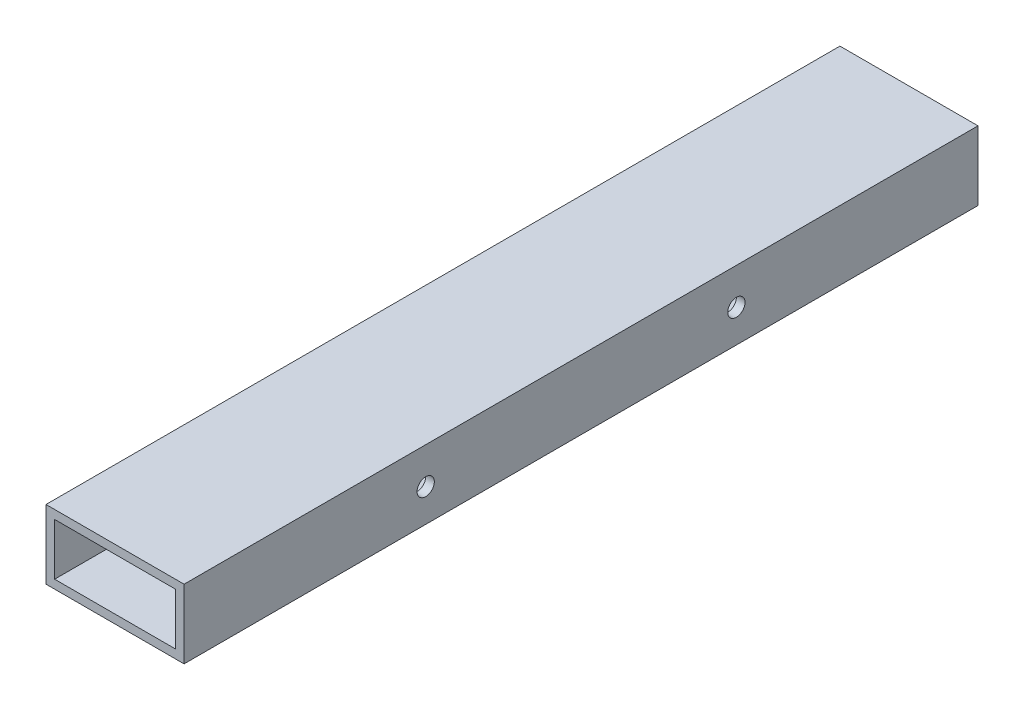
ISO-10303-21;
HEADER;
FILE_DESCRIPTION(('STEP AP214'),'2;1');
FILE_NAME('part.step','',(''),(''),'','','');
FILE_SCHEMA(('AUTOMOTIVE_DESIGN { 1 0 10303 214 1 1 1 1 }'));
ENDSEC;
DATA;
#1=APPLICATION_CONTEXT('core data for automotive mechanical design processes');
#2=APPLICATION_PROTOCOL_DEFINITION('international standard','automotive_design',2000,#1);
#3=PRODUCT_CONTEXT('',#1,'mechanical');
#4=PRODUCT('Part','Part','',(#3));
#5=PRODUCT_RELATED_PRODUCT_CATEGORY('part','',(#4));
#6=PRODUCT_DEFINITION_FORMATION('','',#4);
#7=PRODUCT_DEFINITION_CONTEXT('part definition',#1,'design');
#8=PRODUCT_DEFINITION('design','',#6,#7);
#9=PRODUCT_DEFINITION_SHAPE('','',#8);
#10=(LENGTH_UNIT() NAMED_UNIT(*) SI_UNIT(.MILLI.,.METRE.));
#11=(NAMED_UNIT(*) PLANE_ANGLE_UNIT() SI_UNIT($,.RADIAN.));
#12=(NAMED_UNIT(*) SI_UNIT($,.STERADIAN.) SOLID_ANGLE_UNIT());
#13=UNCERTAINTY_MEASURE_WITH_UNIT(LENGTH_MEASURE(1.E-05),#10,'distance_accuracy_value','');
#14=(GEOMETRIC_REPRESENTATION_CONTEXT(3) GLOBAL_UNCERTAINTY_ASSIGNED_CONTEXT((#13)) GLOBAL_UNIT_ASSIGNED_CONTEXT((#10,
#11,#12)) REPRESENTATION_CONTEXT('',''));
#15=CARTESIAN_POINT('',(0.,0.,0.));
#16=DIRECTION('',(0.,0.,1.));
#17=DIRECTION('',(1.,0.,0.));
#18=AXIS2_PLACEMENT_3D('',#15,#16,#17);
#19=CARTESIAN_POINT('',(0.,0.,292.1));
#20=DIRECTION('',(0.,0.,-1.));
#21=DIRECTION('',(-1.,0.,0.));
#22=AXIS2_PLACEMENT_3D('',#19,#20,#21);
#23=PLANE('',#22);
#24=DIRECTION('',(0.,-1.,0.));
#25=VECTOR('',#24,1.);
#26=CARTESIAN_POINT('',(0.,0.,292.1));
#27=LINE('',#26,#25);
#28=CARTESIAN_POINT('',(0.,25.4,292.1));
#29=VERTEX_POINT('',#28);
#30=CARTESIAN_POINT('',(0.,0.,292.1));
#31=VERTEX_POINT('',#30);
#32=EDGE_CURVE('E144',#29,#31,#27,.T.);
#33=ORIENTED_EDGE('',*,*,#32,.T.);
#34=DIRECTION('',(1.,0.,0.));
#35=VECTOR('',#34,1.);
#36=CARTESIAN_POINT('',(0.,0.,292.1));
#37=LINE('',#36,#35);
#38=CARTESIAN_POINT('',(50.8,0.,292.1));
#39=VERTEX_POINT('',#38);
#40=EDGE_CURVE('E147',#31,#39,#37,.T.);
#41=ORIENTED_EDGE('',*,*,#40,.T.);
#42=DIRECTION('',(0.,1.,0.));
#43=VECTOR('',#42,1.);
#44=CARTESIAN_POINT('',(50.8,0.,292.1));
#45=LINE('',#44,#43);
#46=CARTESIAN_POINT('',(50.8,25.4,292.1));
#47=VERTEX_POINT('',#46);
#48=EDGE_CURVE('E150',#39,#47,#45,.T.);
#49=ORIENTED_EDGE('',*,*,#48,.T.);
#50=DIRECTION('',(-1.,0.,0.));
#51=VECTOR('',#50,1.);
#52=CARTESIAN_POINT('',(0.,25.4,292.1));
#53=LINE('',#52,#51);
#54=EDGE_CURVE('E152',#47,#29,#53,.T.);
#55=ORIENTED_EDGE('',*,*,#54,.T.);
#56=EDGE_LOOP('',(#33,#41,#49,#55));
#57=FACE_BOUND('',#56,.T.);
#58=DIRECTION('',(0.,-1.,0.));
#59=VECTOR('',#58,1.);
#60=CARTESIAN_POINT('',(3.175,3.175,292.1));
#61=LINE('',#60,#59);
#62=CARTESIAN_POINT('',(3.175,22.225,292.1));
#63=VERTEX_POINT('',#62);
#64=CARTESIAN_POINT('',(3.175,3.175,292.1));
#65=VERTEX_POINT('',#64);
#66=EDGE_CURVE('E106',#63,#65,#61,.T.);
#67=ORIENTED_EDGE('',*,*,#66,.F.);
#68=DIRECTION('',(-1.,0.,0.));
#69=VECTOR('',#68,1.);
#70=CARTESIAN_POINT('',(3.175,22.225,292.1));
#71=LINE('',#70,#69);
#72=CARTESIAN_POINT('',(47.625,22.225,292.1));
#73=VERTEX_POINT('',#72);
#74=EDGE_CURVE('E128',#73,#63,#71,.T.);
#75=ORIENTED_EDGE('',*,*,#74,.F.);
#76=DIRECTION('',(0.,1.,0.));
#77=VECTOR('',#76,1.);
#78=CARTESIAN_POINT('',(47.625,3.175,292.1));
#79=LINE('',#78,#77);
#80=CARTESIAN_POINT('',(47.625,3.175,292.1));
#81=VERTEX_POINT('',#80);
#82=EDGE_CURVE('E126',#81,#73,#79,.T.);
#83=ORIENTED_EDGE('',*,*,#82,.F.);
#84=DIRECTION('',(1.,0.,0.));
#85=VECTOR('',#84,1.);
#86=CARTESIAN_POINT('',(3.175,3.175,292.1));
#87=LINE('',#86,#85);
#88=EDGE_CURVE('E114',#65,#81,#87,.T.);
#89=ORIENTED_EDGE('',*,*,#88,.F.);
#90=EDGE_LOOP('',(#67,#75,#83,#89));
#91=FACE_BOUND('',#90,.T.);
#92=ADVANCED_FACE('F39',(#57,#91),#23,.F.);
#93=CARTESIAN_POINT('',(0.,0.,0.));
#94=DIRECTION('',(0.,0.,-1.));
#95=DIRECTION('',(-1.,0.,0.));
#96=AXIS2_PLACEMENT_3D('',#93,#94,#95);
#97=PLANE('',#96);
#98=DIRECTION('',(0.,-1.,0.));
#99=VECTOR('',#98,1.);
#100=CARTESIAN_POINT('',(0.,0.,0.));
#101=LINE('',#100,#99);
#102=CARTESIAN_POINT('',(0.,25.4,0.));
#103=VERTEX_POINT('',#102);
#104=CARTESIAN_POINT('',(0.,0.,0.));
#105=VERTEX_POINT('',#104);
#106=EDGE_CURVE('E122',#103,#105,#101,.T.);
#107=ORIENTED_EDGE('',*,*,#106,.F.);
#108=DIRECTION('',(-1.,0.,0.));
#109=VECTOR('',#108,1.);
#110=CARTESIAN_POINT('',(0.,25.4,0.));
#111=LINE('',#110,#109);
#112=CARTESIAN_POINT('',(50.8,25.4,0.));
#113=VERTEX_POINT('',#112);
#114=EDGE_CURVE('E148',#113,#103,#111,.T.);
#115=ORIENTED_EDGE('',*,*,#114,.F.);
#116=DIRECTION('',(0.,1.,0.));
#117=VECTOR('',#116,1.);
#118=CARTESIAN_POINT('',(50.8,0.,0.));
#119=LINE('',#118,#117);
#120=CARTESIAN_POINT('',(50.8,0.,0.));
#121=VERTEX_POINT('',#120);
#122=EDGE_CURVE('E159',#121,#113,#119,.T.);
#123=ORIENTED_EDGE('',*,*,#122,.F.);
#124=DIRECTION('',(1.,0.,0.));
#125=VECTOR('',#124,1.);
#126=CARTESIAN_POINT('',(0.,0.,0.));
#127=LINE('',#126,#125);
#128=EDGE_CURVE('E157',#105,#121,#127,.T.);
#129=ORIENTED_EDGE('',*,*,#128,.F.);
#130=EDGE_LOOP('',(#107,#115,#123,#129));
#131=FACE_BOUND('',#130,.T.);
#132=DIRECTION('',(-1.,0.,0.));
#133=VECTOR('',#132,1.);
#134=CARTESIAN_POINT('',(3.175,22.225,0.));
#135=LINE('',#134,#133);
#136=CARTESIAN_POINT('',(47.625,22.225,0.));
#137=VERTEX_POINT('',#136);
#138=CARTESIAN_POINT('',(3.175,22.225,0.));
#139=VERTEX_POINT('',#138);
#140=EDGE_CURVE('E115',#137,#139,#135,.T.);
#141=ORIENTED_EDGE('',*,*,#140,.T.);
#142=DIRECTION('',(0.,-1.,0.));
#143=VECTOR('',#142,1.);
#144=CARTESIAN_POINT('',(3.175,3.175,0.));
#145=LINE('',#144,#143);
#146=CARTESIAN_POINT('',(3.175,3.175,0.));
#147=VERTEX_POINT('',#146);
#148=EDGE_CURVE('E64',#139,#147,#145,.T.);
#149=ORIENTED_EDGE('',*,*,#148,.T.);
#150=DIRECTION('',(1.,0.,0.));
#151=VECTOR('',#150,1.);
#152=CARTESIAN_POINT('',(3.175,3.175,0.));
#153=LINE('',#152,#151);
#154=CARTESIAN_POINT('',(47.625,3.175,0.));
#155=VERTEX_POINT('',#154);
#156=EDGE_CURVE('E121',#147,#155,#153,.T.);
#157=ORIENTED_EDGE('',*,*,#156,.T.);
#158=DIRECTION('',(0.,1.,0.));
#159=VECTOR('',#158,1.);
#160=CARTESIAN_POINT('',(47.625,3.175,0.));
#161=LINE('',#160,#159);
#162=EDGE_CURVE('E136',#155,#137,#161,.T.);
#163=ORIENTED_EDGE('',*,*,#162,.T.);
#164=EDGE_LOOP('',(#141,#149,#157,#163));
#165=FACE_BOUND('',#164,.T.);
#166=ADVANCED_FACE('F206',(#131,#165),#97,.T.);
#167=CARTESIAN_POINT('',(0.,0.,292.1));
#168=DIRECTION('',(1.,0.,0.));
#169=DIRECTION('',(0.,0.,-1.));
#170=AXIS2_PLACEMENT_3D('',#167,#168,#169);
#171=PLANE('',#170);
#172=CARTESIAN_POINT('',(0.,12.0267583984575,203.2));
#173=DIRECTION('',(1.,0.,0.));
#174=DIRECTION('',(0.,0.,-1.));
#175=AXIS2_PLACEMENT_3D('',#172,#173,#174);
#176=CIRCLE('',#175,3.17499999999997);
#177=CARTESIAN_POINT('',(0.,12.0267583984575,200.025));
#178=VERTEX_POINT('',#177);
#179=EDGE_CURVE('E171',#178,#178,#176,.T.);
#180=ORIENTED_EDGE('',*,*,#179,.T.);
#181=EDGE_LOOP('',(#180));
#182=FACE_BOUND('',#181,.T.);
#183=CARTESIAN_POINT('',(0.,12.0267583984575,88.9));
#184=DIRECTION('',(1.,0.,0.));
#185=DIRECTION('',(0.,0.,-1.));
#186=AXIS2_PLACEMENT_3D('',#183,#184,#185);
#187=CIRCLE('',#186,3.175);
#188=CARTESIAN_POINT('',(0.,12.0267583984575,85.725));
#189=VERTEX_POINT('',#188);
#190=EDGE_CURVE('E187',#189,#189,#187,.T.);
#191=ORIENTED_EDGE('',*,*,#190,.T.);
#192=EDGE_LOOP('',(#191));
#193=FACE_BOUND('',#192,.T.);
#194=ORIENTED_EDGE('',*,*,#106,.T.);
#195=DIRECTION('',(0.,0.,-1.));
#196=VECTOR('',#195,1.);
#197=CARTESIAN_POINT('',(0.,0.,292.1));
#198=LINE('',#197,#196);
#199=EDGE_CURVE('E11',#31,#105,#198,.T.);
#200=ORIENTED_EDGE('',*,*,#199,.F.);
#201=ORIENTED_EDGE('',*,*,#32,.F.);
#202=DIRECTION('',(0.,0.,-1.));
#203=VECTOR('',#202,1.);
#204=CARTESIAN_POINT('',(0.,25.4,292.1));
#205=LINE('',#204,#203);
#206=EDGE_CURVE('E154',#29,#103,#205,.T.);
#207=ORIENTED_EDGE('',*,*,#206,.T.);
#208=EDGE_LOOP('',(#194,#200,#201,#207));
#209=FACE_BOUND('',#208,.T.);
#210=ADVANCED_FACE('F41',(#182,#193,#209),#171,.F.);
#211=CARTESIAN_POINT('',(0.,0.,292.1));
#212=DIRECTION('',(0.,1.,0.));
#213=DIRECTION('',(0.,0.,1.));
#214=AXIS2_PLACEMENT_3D('',#211,#212,#213);
#215=PLANE('',#214);
#216=ORIENTED_EDGE('',*,*,#128,.T.);
#217=DIRECTION('',(0.,0.,-1.));
#218=VECTOR('',#217,1.);
#219=CARTESIAN_POINT('',(50.8,0.,292.1));
#220=LINE('',#219,#218);
#221=EDGE_CURVE('E48',#39,#121,#220,.T.);
#222=ORIENTED_EDGE('',*,*,#221,.F.);
#223=ORIENTED_EDGE('',*,*,#40,.F.);
#224=ORIENTED_EDGE('',*,*,#199,.T.);
#225=EDGE_LOOP('',(#216,#222,#223,#224));
#226=FACE_BOUND('',#225,.T.);
#227=ADVANCED_FACE('F234',(#226),#215,.F.);
#228=CARTESIAN_POINT('',(50.8,0.,292.1));
#229=DIRECTION('',(-1.,0.,0.));
#230=DIRECTION('',(0.,0.,1.));
#231=AXIS2_PLACEMENT_3D('',#228,#229,#230);
#232=PLANE('',#231);
#233=CARTESIAN_POINT('',(50.8,12.0267583984575,203.2));
#234=DIRECTION('',(1.,0.,0.));
#235=DIRECTION('',(0.,0.,-1.));
#236=AXIS2_PLACEMENT_3D('',#233,#234,#235);
#237=CIRCLE('',#236,3.17499999999997);
#238=CARTESIAN_POINT('',(50.8,12.0267583984575,200.025));
#239=VERTEX_POINT('',#238);
#240=EDGE_CURVE('E177',#239,#239,#237,.T.);
#241=ORIENTED_EDGE('',*,*,#240,.F.);
#242=EDGE_LOOP('',(#241));
#243=FACE_BOUND('',#242,.T.);
#244=CARTESIAN_POINT('',(50.8,12.0267583984575,88.9));
#245=DIRECTION('',(1.,0.,0.));
#246=DIRECTION('',(0.,0.,-1.));
#247=AXIS2_PLACEMENT_3D('',#244,#245,#246);
#248=CIRCLE('',#247,3.175);
#249=CARTESIAN_POINT('',(50.8,12.0267583984575,85.725));
#250=VERTEX_POINT('',#249);
#251=EDGE_CURVE('E182',#250,#250,#248,.T.);
#252=ORIENTED_EDGE('',*,*,#251,.F.);
#253=EDGE_LOOP('',(#252));
#254=FACE_BOUND('',#253,.T.);
#255=ORIENTED_EDGE('',*,*,#122,.T.);
#256=DIRECTION('',(0.,0.,-1.));
#257=VECTOR('',#256,1.);
#258=CARTESIAN_POINT('',(50.8,25.4,292.1));
#259=LINE('',#258,#257);
#260=EDGE_CURVE('E164',#47,#113,#259,.T.);
#261=ORIENTED_EDGE('',*,*,#260,.F.);
#262=ORIENTED_EDGE('',*,*,#48,.F.);
#263=ORIENTED_EDGE('',*,*,#221,.T.);
#264=EDGE_LOOP('',(#255,#261,#262,#263));
#265=FACE_BOUND('',#264,.T.);
#266=ADVANCED_FACE('F231',(#243,#254,#265),#232,.F.);
#267=CARTESIAN_POINT('',(0.,25.4,292.1));
#268=DIRECTION('',(0.,-1.,0.));
#269=DIRECTION('',(0.,0.,-1.));
#270=AXIS2_PLACEMENT_3D('',#267,#268,#269);
#271=PLANE('',#270);
#272=ORIENTED_EDGE('',*,*,#114,.T.);
#273=ORIENTED_EDGE('',*,*,#206,.F.);
#274=ORIENTED_EDGE('',*,*,#54,.F.);
#275=ORIENTED_EDGE('',*,*,#260,.T.);
#276=EDGE_LOOP('',(#272,#273,#274,#275));
#277=FACE_BOUND('',#276,.T.);
#278=ADVANCED_FACE('F228',(#277),#271,.F.);
#279=CARTESIAN_POINT('',(3.175,3.175,292.1));
#280=DIRECTION('',(1.,0.,0.));
#281=DIRECTION('',(0.,0.,-1.));
#282=AXIS2_PLACEMENT_3D('',#279,#280,#281);
#283=PLANE('',#282);
#284=CARTESIAN_POINT('',(3.175,12.0267583984575,203.2));
#285=DIRECTION('',(1.,0.,0.));
#286=DIRECTION('',(0.,0.,-1.));
#287=AXIS2_PLACEMENT_3D('',#284,#285,#286);
#288=CIRCLE('',#287,3.17499999999997);
#289=CARTESIAN_POINT('',(3.175,12.0267583984575,200.025));
#290=VERTEX_POINT('',#289);
#291=EDGE_CURVE('E134',#290,#290,#288,.T.);
#292=ORIENTED_EDGE('',*,*,#291,.F.);
#293=EDGE_LOOP('',(#292));
#294=FACE_BOUND('',#293,.T.);
#295=CARTESIAN_POINT('',(3.175,12.0267583984575,88.9));
#296=DIRECTION('',(1.,0.,0.));
#297=DIRECTION('',(0.,0.,-1.));
#298=AXIS2_PLACEMENT_3D('',#295,#296,#297);
#299=CIRCLE('',#298,3.175);
#300=CARTESIAN_POINT('',(3.175,12.0267583984575,85.725));
#301=VERTEX_POINT('',#300);
#302=EDGE_CURVE('E170',#301,#301,#299,.T.);
#303=ORIENTED_EDGE('',*,*,#302,.F.);
#304=EDGE_LOOP('',(#303));
#305=FACE_BOUND('',#304,.T.);
#306=ORIENTED_EDGE('',*,*,#148,.F.);
#307=DIRECTION('',(0.,0.,-1.));
#308=VECTOR('',#307,1.);
#309=CARTESIAN_POINT('',(3.175,22.225,292.1));
#310=LINE('',#309,#308);
#311=EDGE_CURVE('E110',#63,#139,#310,.T.);
#312=ORIENTED_EDGE('',*,*,#311,.F.);
#313=ORIENTED_EDGE('',*,*,#66,.T.);
#314=DIRECTION('',(0.,0.,-1.));
#315=VECTOR('',#314,1.);
#316=CARTESIAN_POINT('',(3.175,3.175,292.1));
#317=LINE('',#316,#315);
#318=EDGE_CURVE('E109',#65,#147,#317,.T.);
#319=ORIENTED_EDGE('',*,*,#318,.T.);
#320=EDGE_LOOP('',(#306,#312,#313,#319));
#321=FACE_BOUND('',#320,.T.);
#322=ADVANCED_FACE('F108',(#294,#305,#321),#283,.T.);
#323=CARTESIAN_POINT('',(3.175,3.175,292.1));
#324=DIRECTION('',(0.,1.,0.));
#325=DIRECTION('',(0.,0.,1.));
#326=AXIS2_PLACEMENT_3D('',#323,#324,#325);
#327=PLANE('',#326);
#328=ORIENTED_EDGE('',*,*,#156,.F.);
#329=ORIENTED_EDGE('',*,*,#318,.F.);
#330=ORIENTED_EDGE('',*,*,#88,.T.);
#331=DIRECTION('',(0.,0.,-1.));
#332=VECTOR('',#331,1.);
#333=CARTESIAN_POINT('',(47.625,3.175,292.1));
#334=LINE('',#333,#332);
#335=EDGE_CURVE('E123',#81,#155,#334,.T.);
#336=ORIENTED_EDGE('',*,*,#335,.T.);
#337=EDGE_LOOP('',(#328,#329,#330,#336));
#338=FACE_BOUND('',#337,.T.);
#339=ADVANCED_FACE('F118',(#338),#327,.T.);
#340=CARTESIAN_POINT('',(47.625,3.175,292.1));
#341=DIRECTION('',(-1.,0.,0.));
#342=DIRECTION('',(0.,0.,1.));
#343=AXIS2_PLACEMENT_3D('',#340,#341,#342);
#344=PLANE('',#343);
#345=CARTESIAN_POINT('',(47.625,12.0267583984575,203.2));
#346=DIRECTION('',(-1.,0.,0.));
#347=DIRECTION('',(0.,0.,1.));
#348=AXIS2_PLACEMENT_3D('',#345,#346,#347);
#349=CIRCLE('',#348,3.17499999999997);
#350=CARTESIAN_POINT('',(47.625,12.0267583984575,206.375));
#351=VERTEX_POINT('',#350);
#352=EDGE_CURVE('E43',#351,#351,#349,.T.);
#353=ORIENTED_EDGE('',*,*,#352,.F.);
#354=EDGE_LOOP('',(#353));
#355=FACE_BOUND('',#354,.T.);
#356=CARTESIAN_POINT('',(47.625,12.0267583984575,88.9));
#357=DIRECTION('',(-1.,0.,0.));
#358=DIRECTION('',(0.,0.,1.));
#359=AXIS2_PLACEMENT_3D('',#356,#357,#358);
#360=CIRCLE('',#359,3.175);
#361=CARTESIAN_POINT('',(47.625,12.0267583984575,92.075));
#362=VERTEX_POINT('',#361);
#363=EDGE_CURVE('E168',#362,#362,#360,.T.);
#364=ORIENTED_EDGE('',*,*,#363,.F.);
#365=EDGE_LOOP('',(#364));
#366=FACE_BOUND('',#365,.T.);
#367=ORIENTED_EDGE('',*,*,#162,.F.);
#368=ORIENTED_EDGE('',*,*,#335,.F.);
#369=ORIENTED_EDGE('',*,*,#82,.T.);
#370=DIRECTION('',(0.,0.,-1.));
#371=VECTOR('',#370,1.);
#372=CARTESIAN_POINT('',(47.625,22.225,292.1));
#373=LINE('',#372,#371);
#374=EDGE_CURVE('E56',#73,#137,#373,.T.);
#375=ORIENTED_EDGE('',*,*,#374,.T.);
#376=EDGE_LOOP('',(#367,#368,#369,#375));
#377=FACE_BOUND('',#376,.T.);
#378=ADVANCED_FACE('F198',(#355,#366,#377),#344,.T.);
#379=CARTESIAN_POINT('',(3.175,22.225,292.1));
#380=DIRECTION('',(0.,-1.,0.));
#381=DIRECTION('',(0.,0.,-1.));
#382=AXIS2_PLACEMENT_3D('',#379,#380,#381);
#383=PLANE('',#382);
#384=ORIENTED_EDGE('',*,*,#140,.F.);
#385=ORIENTED_EDGE('',*,*,#374,.F.);
#386=ORIENTED_EDGE('',*,*,#74,.T.);
#387=ORIENTED_EDGE('',*,*,#311,.T.);
#388=EDGE_LOOP('',(#384,#385,#386,#387));
#389=FACE_BOUND('',#388,.T.);
#390=ADVANCED_FACE('F201',(#389),#383,.T.);
#391=CARTESIAN_POINT('',(0.,12.0267583984575,88.9));
#392=DIRECTION('',(1.,0.,0.));
#393=DIRECTION('',(0.,0.,-1.));
#394=AXIS2_PLACEMENT_3D('',#391,#392,#393);
#395=CYLINDRICAL_SURFACE('',#394,3.175);
#396=ORIENTED_EDGE('',*,*,#363,.T.);
#397=EDGE_LOOP('',(#396));
#398=FACE_BOUND('',#397,.T.);
#399=ORIENTED_EDGE('',*,*,#251,.T.);
#400=EDGE_LOOP('',(#399));
#401=FACE_BOUND('',#400,.T.);
#402=ADVANCED_FACE('F208',(#398,#401),#395,.F.);
#403=CARTESIAN_POINT('',(0.,12.0267583984575,203.2));
#404=DIRECTION('',(1.,0.,0.));
#405=DIRECTION('',(0.,0.,-1.));
#406=AXIS2_PLACEMENT_3D('',#403,#404,#405);
#407=CYLINDRICAL_SURFACE('',#406,3.17499999999997);
#408=ORIENTED_EDGE('',*,*,#352,.T.);
#409=EDGE_LOOP('',(#408));
#410=FACE_BOUND('',#409,.T.);
#411=ORIENTED_EDGE('',*,*,#240,.T.);
#412=EDGE_LOOP('',(#411));
#413=FACE_BOUND('',#412,.T.);
#414=ADVANCED_FACE('F195',(#410,#413),#407,.F.);
#415=ORIENTED_EDGE('',*,*,#302,.T.);
#416=EDGE_LOOP('',(#415));
#417=FACE_BOUND('',#416,.T.);
#418=ORIENTED_EDGE('',*,*,#190,.F.);
#419=EDGE_LOOP('',(#418));
#420=FACE_BOUND('',#419,.T.);
#421=ADVANCED_FACE('F216',(#417,#420),#395,.F.);
#422=ORIENTED_EDGE('',*,*,#291,.T.);
#423=EDGE_LOOP('',(#422));
#424=FACE_BOUND('',#423,.T.);
#425=ORIENTED_EDGE('',*,*,#179,.F.);
#426=EDGE_LOOP('',(#425));
#427=FACE_BOUND('',#426,.T.);
#428=ADVANCED_FACE('F258',(#424,#427),#407,.F.);
#429=CLOSED_SHELL('',(#92,#166,#210,#227,#266,#278,#322,#339,#378,#390,#402,#414,#421,#428));
#430=MANIFOLD_SOLID_BREP('B2',#429);
#431=ADVANCED_BREP_SHAPE_REPRESENTATION('',(#18,#430),#14);
#432=SHAPE_DEFINITION_REPRESENTATION(#9,#431);
ENDSEC;
END-ISO-10303-21;
